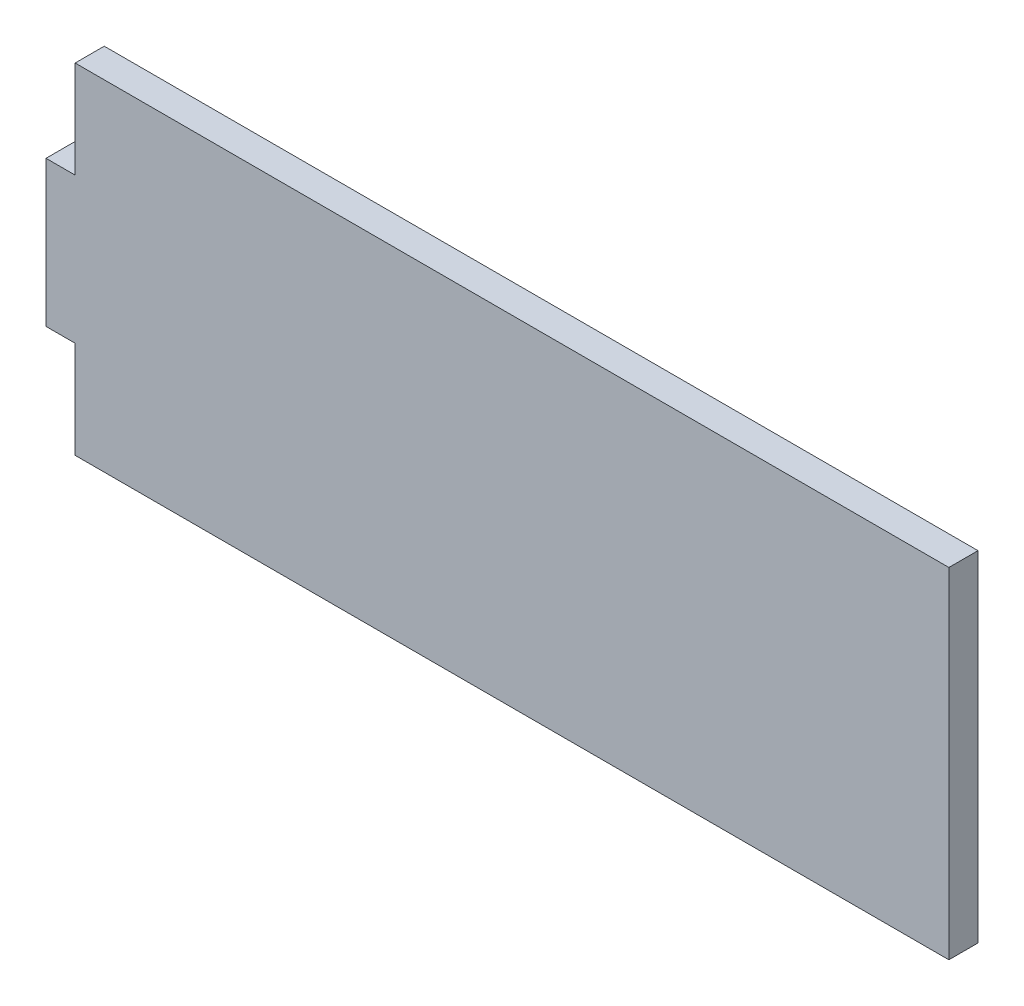
ISO-10303-21;
HEADER;
FILE_DESCRIPTION(('STEP AP214'),'2;1');
FILE_NAME('part.step','',(''),(''),'','','');
FILE_SCHEMA(('AUTOMOTIVE_DESIGN { 1 0 10303 214 1 1 1 1 }'));
ENDSEC;
DATA;
#1=APPLICATION_CONTEXT('core data for automotive mechanical design processes');
#2=APPLICATION_PROTOCOL_DEFINITION('international standard','automotive_design',2000,#1);
#3=PRODUCT_CONTEXT('',#1,'mechanical');
#4=PRODUCT('Part','Part','',(#3));
#5=PRODUCT_RELATED_PRODUCT_CATEGORY('part','',(#4));
#6=PRODUCT_DEFINITION_FORMATION('','',#4);
#7=PRODUCT_DEFINITION_CONTEXT('part definition',#1,'design');
#8=PRODUCT_DEFINITION('design','',#6,#7);
#9=PRODUCT_DEFINITION_SHAPE('','',#8);
#10=(LENGTH_UNIT() NAMED_UNIT(*) SI_UNIT(.MILLI.,.METRE.));
#11=(NAMED_UNIT(*) PLANE_ANGLE_UNIT() SI_UNIT($,.RADIAN.));
#12=(NAMED_UNIT(*) SI_UNIT($,.STERADIAN.) SOLID_ANGLE_UNIT());
#13=UNCERTAINTY_MEASURE_WITH_UNIT(LENGTH_MEASURE(1.E-05),#10,'distance_accuracy_value','');
#14=(GEOMETRIC_REPRESENTATION_CONTEXT(3) GLOBAL_UNCERTAINTY_ASSIGNED_CONTEXT((#13)) GLOBAL_UNIT_ASSIGNED_CONTEXT((#10,
#11,#12)) REPRESENTATION_CONTEXT('',''));
#15=CARTESIAN_POINT('',(0.,0.,0.));
#16=DIRECTION('',(0.,0.,1.));
#17=DIRECTION('',(1.,0.,0.));
#18=AXIS2_PLACEMENT_3D('',#15,#16,#17);
#19=CARTESIAN_POINT('',(0.,-17.5,1.5));
#20=DIRECTION('',(0.,1.,0.));
#21=DIRECTION('',(0.,0.,1.));
#22=AXIS2_PLACEMENT_3D('',#19,#20,#21);
#23=PLANE('',#22);
#24=DIRECTION('',(1.,0.,0.));
#25=VECTOR('',#24,1.);
#26=CARTESIAN_POINT('',(0.,-17.5,-1.5));
#27=LINE('',#26,#25);
#28=CARTESIAN_POINT('',(-45.,-17.5,-1.5));
#29=VERTEX_POINT('',#28);
#30=CARTESIAN_POINT('',(45.,-17.5,-1.5));
#31=VERTEX_POINT('',#30);
#32=EDGE_CURVE('E135',#29,#31,#27,.T.);
#33=ORIENTED_EDGE('',*,*,#32,.T.);
#34=DIRECTION('',(0.,0.,-1.));
#35=VECTOR('',#34,1.);
#36=CARTESIAN_POINT('',(45.,-17.5,1.5));
#37=LINE('',#36,#35);
#38=CARTESIAN_POINT('',(45.,-17.5,1.5));
#39=VERTEX_POINT('',#38);
#40=EDGE_CURVE('E12',#39,#31,#37,.T.);
#41=ORIENTED_EDGE('',*,*,#40,.F.);
#42=DIRECTION('',(1.,0.,0.));
#43=VECTOR('',#42,1.);
#44=CARTESIAN_POINT('',(0.,-17.5,1.5));
#45=LINE('',#44,#43);
#46=CARTESIAN_POINT('',(-45.,-17.5,1.5));
#47=VERTEX_POINT('',#46);
#48=EDGE_CURVE('E154',#47,#39,#45,.T.);
#49=ORIENTED_EDGE('',*,*,#48,.F.);
#50=DIRECTION('',(0.,0.,-1.));
#51=VECTOR('',#50,1.);
#52=CARTESIAN_POINT('',(-45.,-17.5,1.5));
#53=LINE('',#52,#51);
#54=EDGE_CURVE('E51',#47,#29,#53,.T.);
#55=ORIENTED_EDGE('',*,*,#54,.T.);
#56=EDGE_LOOP('',(#33,#41,#49,#55));
#57=FACE_BOUND('',#56,.T.);
#58=ADVANCED_FACE('F35',(#57),#23,.F.);
#59=CARTESIAN_POINT('',(45.,0.,1.5));
#60=DIRECTION('',(-1.,0.,0.));
#61=DIRECTION('',(0.,0.,1.));
#62=AXIS2_PLACEMENT_3D('',#59,#60,#61);
#63=PLANE('',#62);
#64=DIRECTION('',(0.,1.,0.));
#65=VECTOR('',#64,1.);
#66=CARTESIAN_POINT('',(45.,0.,-1.5));
#67=LINE('',#66,#65);
#68=CARTESIAN_POINT('',(45.,17.5,-1.5));
#69=VERTEX_POINT('',#68);
#70=EDGE_CURVE('E172',#31,#69,#67,.T.);
#71=ORIENTED_EDGE('',*,*,#70,.T.);
#72=DIRECTION('',(0.,0.,-1.));
#73=VECTOR('',#72,1.);
#74=CARTESIAN_POINT('',(45.,17.5,1.5));
#75=LINE('',#74,#73);
#76=CARTESIAN_POINT('',(45.,17.5,1.5));
#77=VERTEX_POINT('',#76);
#78=EDGE_CURVE('E43',#77,#69,#75,.T.);
#79=ORIENTED_EDGE('',*,*,#78,.F.);
#80=DIRECTION('',(0.,1.,0.));
#81=VECTOR('',#80,1.);
#82=CARTESIAN_POINT('',(45.,0.,1.5));
#83=LINE('',#82,#81);
#84=EDGE_CURVE('E89',#39,#77,#83,.T.);
#85=ORIENTED_EDGE('',*,*,#84,.F.);
#86=ORIENTED_EDGE('',*,*,#40,.T.);
#87=EDGE_LOOP('',(#71,#79,#85,#86));
#88=FACE_BOUND('',#87,.T.);
#89=ADVANCED_FACE('F192',(#88),#63,.F.);
#90=CARTESIAN_POINT('',(0.,17.5,1.5));
#91=DIRECTION('',(0.,1.,0.));
#92=DIRECTION('',(0.,0.,1.));
#93=AXIS2_PLACEMENT_3D('',#90,#91,#92);
#94=PLANE('',#93);
#95=DIRECTION('',(1.,0.,0.));
#96=VECTOR('',#95,1.);
#97=CARTESIAN_POINT('',(0.,17.5,-1.5));
#98=LINE('',#97,#96);
#99=CARTESIAN_POINT('',(-45.,17.5,-1.5));
#100=VERTEX_POINT('',#99);
#101=EDGE_CURVE('E168',#100,#69,#98,.T.);
#102=ORIENTED_EDGE('',*,*,#101,.F.);
#103=DIRECTION('',(0.,0.,-1.));
#104=VECTOR('',#103,1.);
#105=CARTESIAN_POINT('',(-45.,17.5,1.5));
#106=LINE('',#105,#104);
#107=CARTESIAN_POINT('',(-45.,17.5,1.5));
#108=VERTEX_POINT('',#107);
#109=EDGE_CURVE('E280',#108,#100,#106,.T.);
#110=ORIENTED_EDGE('',*,*,#109,.F.);
#111=DIRECTION('',(1.,0.,0.));
#112=VECTOR('',#111,1.);
#113=CARTESIAN_POINT('',(0.,17.5,1.5));
#114=LINE('',#113,#112);
#115=EDGE_CURVE('E145',#108,#77,#114,.T.);
#116=ORIENTED_EDGE('',*,*,#115,.T.);
#117=ORIENTED_EDGE('',*,*,#78,.T.);
#118=EDGE_LOOP('',(#102,#110,#116,#117));
#119=FACE_BOUND('',#118,.T.);
#120=ADVANCED_FACE('F189',(#119),#94,.T.);
#121=CARTESIAN_POINT('',(-45.,0.,1.5));
#122=DIRECTION('',(-1.,0.,0.));
#123=DIRECTION('',(0.,0.,1.));
#124=AXIS2_PLACEMENT_3D('',#121,#122,#123);
#125=PLANE('',#124);
#126=DIRECTION('',(0.,1.,0.));
#127=VECTOR('',#126,1.);
#128=CARTESIAN_POINT('',(-45.,0.,-1.5));
#129=LINE('',#128,#127);
#130=CARTESIAN_POINT('',(-45.,7.5,-1.5));
#131=VERTEX_POINT('',#130);
#132=EDGE_CURVE('E161',#131,#100,#129,.T.);
#133=ORIENTED_EDGE('',*,*,#132,.F.);
#134=DIRECTION('',(0.,0.,-1.));
#135=VECTOR('',#134,1.);
#136=CARTESIAN_POINT('',(-45.,7.5,1.5));
#137=LINE('',#136,#135);
#138=CARTESIAN_POINT('',(-45.,7.5,1.5));
#139=VERTEX_POINT('',#138);
#140=EDGE_CURVE('E273',#139,#131,#137,.T.);
#141=ORIENTED_EDGE('',*,*,#140,.F.);
#142=DIRECTION('',(0.,1.,0.));
#143=VECTOR('',#142,1.);
#144=CARTESIAN_POINT('',(-45.,0.,1.5));
#145=LINE('',#144,#143);
#146=EDGE_CURVE('E130',#139,#108,#145,.T.);
#147=ORIENTED_EDGE('',*,*,#146,.T.);
#148=ORIENTED_EDGE('',*,*,#109,.T.);
#149=EDGE_LOOP('',(#133,#141,#147,#148));
#150=FACE_BOUND('',#149,.T.);
#151=ADVANCED_FACE('F179',(#150),#125,.T.);
#152=CARTESIAN_POINT('',(0.,7.50000000000003,1.5));
#153=DIRECTION('',(0.,-1.,0.));
#154=DIRECTION('',(1.,0.,0.));
#155=AXIS2_PLACEMENT_3D('',#152,#153,#154);
#156=PLANE('',#155);
#157=DIRECTION('',(-1.,0.,0.));
#158=VECTOR('',#157,1.);
#159=CARTESIAN_POINT('',(0.,7.50000000000003,-1.5));
#160=LINE('',#159,#158);
#161=CARTESIAN_POINT('',(-48.,7.5,-1.5));
#162=VERTEX_POINT('',#161);
#163=EDGE_CURVE('E167',#131,#162,#160,.T.);
#164=ORIENTED_EDGE('',*,*,#163,.T.);
#165=DIRECTION('',(0.,0.,-1.));
#166=VECTOR('',#165,1.);
#167=CARTESIAN_POINT('',(-48.,7.5,1.5));
#168=LINE('',#167,#166);
#169=CARTESIAN_POINT('',(-48.,7.5,1.5));
#170=VERTEX_POINT('',#169);
#171=EDGE_CURVE('E125',#170,#162,#168,.T.);
#172=ORIENTED_EDGE('',*,*,#171,.F.);
#173=DIRECTION('',(-1.,0.,0.));
#174=VECTOR('',#173,1.);
#175=CARTESIAN_POINT('',(0.,7.50000000000003,1.5));
#176=LINE('',#175,#174);
#177=EDGE_CURVE('E113',#139,#170,#176,.T.);
#178=ORIENTED_EDGE('',*,*,#177,.F.);
#179=ORIENTED_EDGE('',*,*,#140,.T.);
#180=EDGE_LOOP('',(#164,#172,#178,#179));
#181=FACE_BOUND('',#180,.T.);
#182=ADVANCED_FACE('F188',(#181),#156,.F.);
#183=CARTESIAN_POINT('',(-48.,0.,1.5));
#184=DIRECTION('',(1.,0.,0.));
#185=DIRECTION('',(0.,0.,-1.));
#186=AXIS2_PLACEMENT_3D('',#183,#184,#185);
#187=PLANE('',#186);
#188=DIRECTION('',(0.,-1.,0.));
#189=VECTOR('',#188,1.);
#190=CARTESIAN_POINT('',(-48.,0.,-1.5));
#191=LINE('',#190,#189);
#192=CARTESIAN_POINT('',(-48.,-7.5,-1.5));
#193=VERTEX_POINT('',#192);
#194=EDGE_CURVE('E122',#162,#193,#191,.T.);
#195=ORIENTED_EDGE('',*,*,#194,.T.);
#196=DIRECTION('',(0.,0.,-1.));
#197=VECTOR('',#196,1.);
#198=CARTESIAN_POINT('',(-48.,-7.5,1.5));
#199=LINE('',#198,#197);
#200=CARTESIAN_POINT('',(-48.,-7.5,1.5));
#201=VERTEX_POINT('',#200);
#202=EDGE_CURVE('E119',#201,#193,#199,.T.);
#203=ORIENTED_EDGE('',*,*,#202,.F.);
#204=DIRECTION('',(0.,-1.,0.));
#205=VECTOR('',#204,1.);
#206=CARTESIAN_POINT('',(-48.,0.,1.5));
#207=LINE('',#206,#205);
#208=EDGE_CURVE('E105',#170,#201,#207,.T.);
#209=ORIENTED_EDGE('',*,*,#208,.F.);
#210=ORIENTED_EDGE('',*,*,#171,.T.);
#211=EDGE_LOOP('',(#195,#203,#209,#210));
#212=FACE_BOUND('',#211,.T.);
#213=ADVANCED_FACE('F120',(#212),#187,.F.);
#214=CARTESIAN_POINT('',(0.,-7.50000000000003,1.5));
#215=DIRECTION('',(0.,-1.,0.));
#216=DIRECTION('',(1.,0.,0.));
#217=AXIS2_PLACEMENT_3D('',#214,#215,#216);
#218=PLANE('',#217);
#219=DIRECTION('',(-1.,0.,0.));
#220=VECTOR('',#219,1.);
#221=CARTESIAN_POINT('',(0.,-7.50000000000003,-1.5));
#222=LINE('',#221,#220);
#223=CARTESIAN_POINT('',(-45.,-7.5,-1.5));
#224=VERTEX_POINT('',#223);
#225=EDGE_CURVE('E159',#224,#193,#222,.T.);
#226=ORIENTED_EDGE('',*,*,#225,.F.);
#227=DIRECTION('',(0.,0.,-1.));
#228=VECTOR('',#227,1.);
#229=CARTESIAN_POINT('',(-45.,-7.5,1.5));
#230=LINE('',#229,#228);
#231=CARTESIAN_POINT('',(-45.,-7.5,1.5));
#232=VERTEX_POINT('',#231);
#233=EDGE_CURVE('E77',#232,#224,#230,.T.);
#234=ORIENTED_EDGE('',*,*,#233,.F.);
#235=DIRECTION('',(-1.,0.,0.));
#236=VECTOR('',#235,1.);
#237=CARTESIAN_POINT('',(0.,-7.50000000000003,1.5));
#238=LINE('',#237,#236);
#239=EDGE_CURVE('E110',#232,#201,#238,.T.);
#240=ORIENTED_EDGE('',*,*,#239,.T.);
#241=ORIENTED_EDGE('',*,*,#202,.T.);
#242=EDGE_LOOP('',(#226,#234,#240,#241));
#243=FACE_BOUND('',#242,.T.);
#244=ADVANCED_FACE('F127',(#243),#218,.T.);
#245=EDGE_CURVE('E156',#29,#224,#129,.T.);
#246=ORIENTED_EDGE('',*,*,#245,.F.);
#247=ORIENTED_EDGE('',*,*,#54,.F.);
#248=EDGE_CURVE('E128',#47,#232,#145,.T.);
#249=ORIENTED_EDGE('',*,*,#248,.T.);
#250=ORIENTED_EDGE('',*,*,#233,.T.);
#251=EDGE_LOOP('',(#246,#247,#249,#250));
#252=FACE_BOUND('',#251,.T.);
#253=ADVANCED_FACE('F176',(#252),#125,.T.);
#254=CARTESIAN_POINT('',(0.,0.,1.5));
#255=DIRECTION('',(0.,0.,1.));
#256=DIRECTION('',(1.,0.,0.));
#257=AXIS2_PLACEMENT_3D('',#254,#255,#256);
#258=PLANE('',#257);
#259=ORIENTED_EDGE('',*,*,#48,.T.);
#260=ORIENTED_EDGE('',*,*,#84,.T.);
#261=ORIENTED_EDGE('',*,*,#115,.F.);
#262=ORIENTED_EDGE('',*,*,#146,.F.);
#263=ORIENTED_EDGE('',*,*,#177,.T.);
#264=ORIENTED_EDGE('',*,*,#208,.T.);
#265=ORIENTED_EDGE('',*,*,#239,.F.);
#266=ORIENTED_EDGE('',*,*,#248,.F.);
#267=EDGE_LOOP('',(#259,#260,#261,#262,#263,#264,#265,#266));
#268=FACE_BOUND('',#267,.T.);
#269=ADVANCED_FACE('F107',(#268),#258,.T.);
#270=CARTESIAN_POINT('',(0.,0.,-1.5));
#271=DIRECTION('',(0.,0.,1.));
#272=DIRECTION('',(1.,0.,0.));
#273=AXIS2_PLACEMENT_3D('',#270,#271,#272);
#274=PLANE('',#273);
#275=ORIENTED_EDGE('',*,*,#32,.F.);
#276=ORIENTED_EDGE('',*,*,#245,.T.);
#277=ORIENTED_EDGE('',*,*,#225,.T.);
#278=ORIENTED_EDGE('',*,*,#194,.F.);
#279=ORIENTED_EDGE('',*,*,#163,.F.);
#280=ORIENTED_EDGE('',*,*,#132,.T.);
#281=ORIENTED_EDGE('',*,*,#101,.T.);
#282=ORIENTED_EDGE('',*,*,#70,.F.);
#283=EDGE_LOOP('',(#275,#276,#277,#278,#279,#280,#281,#282));
#284=FACE_BOUND('',#283,.T.);
#285=ADVANCED_FACE('F175',(#284),#274,.F.);
#286=CLOSED_SHELL('',(#58,#89,#120,#151,#182,#213,#244,#253,#269,#285));
#287=MANIFOLD_SOLID_BREP('B2',#286);
#288=ADVANCED_BREP_SHAPE_REPRESENTATION('',(#18,#287),#14);
#289=SHAPE_DEFINITION_REPRESENTATION(#9,#288);
ENDSEC;
END-ISO-10303-21;
